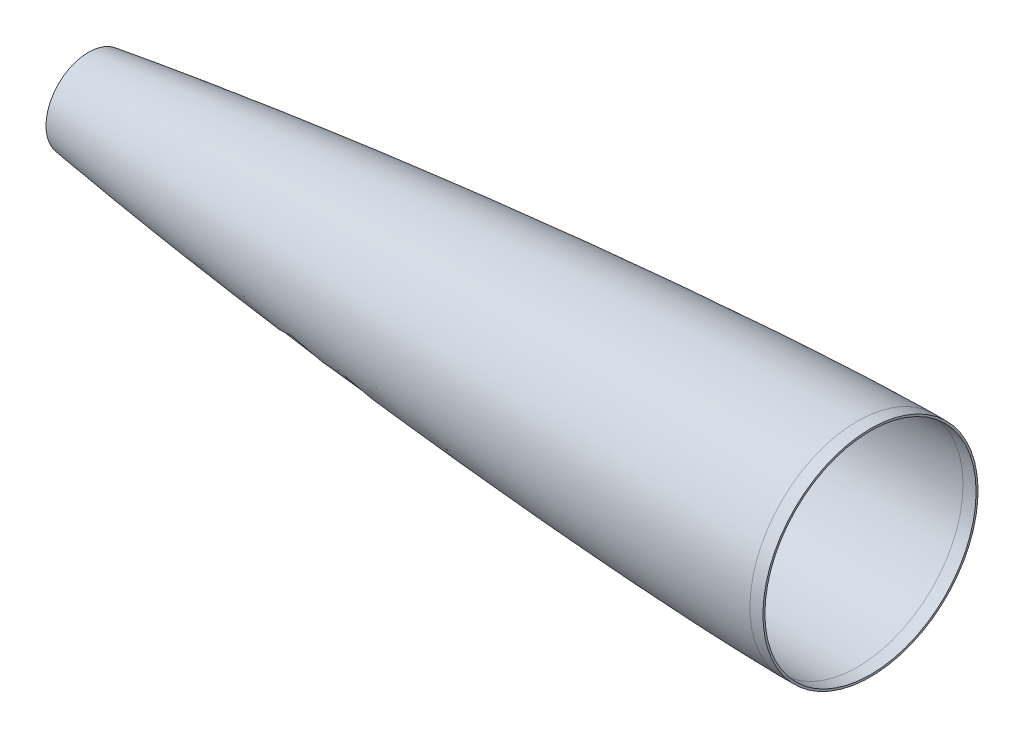
ISO-10303-21;
HEADER;
FILE_DESCRIPTION(('STEP AP214'),'2;1');
FILE_NAME('part.step','',(''),(''),'','','');
FILE_SCHEMA(('AUTOMOTIVE_DESIGN { 1 0 10303 214 1 1 1 1 }'));
ENDSEC;
DATA;
#1=APPLICATION_CONTEXT('core data for automotive mechanical design processes');
#2=APPLICATION_PROTOCOL_DEFINITION('international standard','automotive_design',2000,#1);
#3=PRODUCT_CONTEXT('',#1,'mechanical');
#4=PRODUCT('Part','Part','',(#3));
#5=PRODUCT_RELATED_PRODUCT_CATEGORY('part','',(#4));
#6=PRODUCT_DEFINITION_FORMATION('','',#4);
#7=PRODUCT_DEFINITION_CONTEXT('part definition',#1,'design');
#8=PRODUCT_DEFINITION('design','',#6,#7);
#9=PRODUCT_DEFINITION_SHAPE('','',#8);
#10=(LENGTH_UNIT() NAMED_UNIT(*) SI_UNIT(.MILLI.,.METRE.));
#11=(NAMED_UNIT(*) PLANE_ANGLE_UNIT() SI_UNIT($,.RADIAN.));
#12=(NAMED_UNIT(*) SI_UNIT($,.STERADIAN.) SOLID_ANGLE_UNIT());
#13=UNCERTAINTY_MEASURE_WITH_UNIT(LENGTH_MEASURE(1.E-05),#10,'distance_accuracy_value','');
#14=(GEOMETRIC_REPRESENTATION_CONTEXT(3) GLOBAL_UNCERTAINTY_ASSIGNED_CONTEXT((#13)) GLOBAL_UNIT_ASSIGNED_CONTEXT((#10,
#11,#12)) REPRESENTATION_CONTEXT('',''));
#15=CARTESIAN_POINT('',(0.,0.,0.));
#16=DIRECTION('',(0.,0.,1.));
#17=DIRECTION('',(1.,0.,0.));
#18=AXIS2_PLACEMENT_3D('',#15,#16,#17);
#19=CARTESIAN_POINT('',(0.,0.,0.));
#20=CARTESIAN_POINT('',(0.00246903573026898,0.00769815196811599,0.));
#21=CARTESIAN_POINT('',(0.00852037979638455,0.0225456416973723,0.));
#22=CARTESIAN_POINT('',(0.0254287850938619,0.0499114059335762,0.));
#23=CARTESIAN_POINT('',(0.0656948489665144,0.100096678261966,0.));
#24=CARTESIAN_POINT('',(0.127523873180296,0.16317614387605,0.));
#25=CARTESIAN_POINT('',(0.212062429273832,0.237272492825021,0.));
#26=CARTESIAN_POINT('',(0.332279693831272,0.331578395878514,0.));
#27=CARTESIAN_POINT('',(0.476816380111575,0.434147846193127,0.));
#28=CARTESIAN_POINT('',(0.646496772260084,0.544815951928162,0.));
#29=CARTESIAN_POINT('',(0.841412680935005,0.663024363572451,0.));
#30=CARTESIAN_POINT('',(1.12686422152927,0.826333920179848,0.));
#31=CARTESIAN_POINT('',(1.57274450360088,1.06289215559482,0.));
#32=CARTESIAN_POINT('',(2.33539055045532,1.4322686637271,0.));
#33=CARTESIAN_POINT('',(3.71093173791413,2.02979684979071,0.));
#34=CARTESIAN_POINT('',(6.15457812687039,2.96983830397565,0.));
#35=CARTESIAN_POINT('',(10.6680057521807,4.4902673249165,0.));
#36=CARTESIAN_POINT('',(18.9995170679273,6.91730383821913,0.));
#37=CARTESIAN_POINT('',(33.3857956173297,10.5208699171543,0.));
#38=CARTESIAN_POINT('',(58.21468034422,15.8817272260005,0.));
#39=CARTESIAN_POINT('',(92.5014071109869,22.2363785489674,0.));
#40=CARTESIAN_POINT('',(134.347160824015,29.0668928368045,0.));
#41=CARTESIAN_POINT('',(181.232321927949,35.9138473948452,0.));
#42=CARTESIAN_POINT('',(228.199436648054,42.167572329428,0.));
#43=CARTESIAN_POINT('',(275.229416109303,47.9286839235141,0.));
#44=CARTESIAN_POINT('',(322.309575865078,53.2618983416283,0.));
#45=CARTESIAN_POINT('',(369.432294543761,58.204857708494,0.));
#46=CARTESIAN_POINT('',(416.591925171861,62.781349506755,0.));
#47=CARTESIAN_POINT('',(463.784734461524,67.0021255480557,0.));
#48=CARTESIAN_POINT('',(511.00790004468,70.8684145222591,0.));
#49=CARTESIAN_POINT('',(558.259527801623,74.3703783950666,0.));
#50=CARTESIAN_POINT('',(605.538293136767,77.4858004644496,0.));
#51=CARTESIAN_POINT('',(646.930327878799,79.8372948360595,0.));
#52=CARTESIAN_POINT('',(682.425589554388,81.5391979712966,0.));
#53=CARTESIAN_POINT('',(710.863439025648,82.6553562596267,0.));
#54=CARTESIAN_POINT('',(729.852911101212,83.2590075767634,0.));
#55=CARTESIAN_POINT('',(745.309411706468,83.6327608330306,0.));
#56=CARTESIAN_POINT('',(754.846503833814,83.7859260177921,0.));
#57=CARTESIAN_POINT('',(759.615436090338,83.8348786530274,0.));
#58=CARTESIAN_POINT('',(762.,83.841254665666,0.));
#59=B_SPLINE_CURVE_WITH_KNOTS('',4,(#19,#20,#21,#22,#23,#24,#25,#26,#27,#28,#29,#30,#31,#32,#33,
#34,#35,#36,#37,#38,#39,#40,#41,#42,#43,#44,#45,#46,#47,#48,#49,#50,#51,#52,#53,#54,#55,#56,#57,
#58),.UNSPECIFIED.,.F.,.F.,(5,1,1,1,1,1,1,1,1,1,1,1,1,1,1,1,1,1,1,1,1,1,1,1,1,1,1,1,1,1,1,1,1,1,
1,1,5),(0.,4.17696920660736E-05,8.35393841321473E-05,0.000167078768264295,0.000334157536528589,
0.000501236304792884,0.000668315073057178,0.00096246300283011,0.00125661093260304,
0.0015558461624744,0.00185508139234575,0.00267469423896925,0.00388417928863896,
0.00596702174876591,0.00966166641109553,0.0163036327250282,0.0286756515625839,
0.0511400072011219,0.0868676004745142,0.148543873222001,0.210220157313774,0.271896442541836,
0.333572727029302,0.395249011322683,0.45692529537117,0.518601581123509,0.580277866536271,
0.641954151279229,0.703630435176099,0.765306721163355,0.826983005973056,0.888659290648277,
0.919497433390482,0.950335576132687,0.975167788066344,0.987583894033172,1.),.UNSPECIFIED.);
#60=CARTESIAN_POINT('',(0.,0.,0.));
#61=DIRECTION('',(-1.,0.,0.));
#62=AXIS1_PLACEMENT('',#60,#61);
#63=SURFACE_OF_REVOLUTION('',#59,#62);
#64=CARTESIAN_POINT('',(162.56,0.,0.));
#65=DIRECTION('',(-1.,0.,0.));
#66=DIRECTION('',(0.,-1.,0.));
#67=AXIS2_PLACEMENT_3D('',#64,#65,#66);
#68=CIRCLE('',#67,33.1280498009156);
#69=CARTESIAN_POINT('',(162.56,-33.1280498009156,0.));
#70=VERTEX_POINT('',#69);
#71=EDGE_CURVE('E88',#70,#70,#68,.T.);
#72=ORIENTED_EDGE('',*,*,#71,.F.);
#73=EDGE_LOOP('',(#72));
#74=FACE_BOUND('',#73,.T.);
#75=CARTESIAN_POINT('',(762.,0.,0.));
#76=DIRECTION('',(1.,0.,0.));
#77=DIRECTION('',(0.,1.,0.));
#78=AXIS2_PLACEMENT_3D('',#75,#76,#77);
#79=CIRCLE('',#78,83.841254665666);
#80=CARTESIAN_POINT('',(762.,83.841254665666,0.));
#81=VERTEX_POINT('',#80);
#82=EDGE_CURVE('E46',#81,#81,#79,.T.);
#83=ORIENTED_EDGE('',*,*,#82,.F.);
#84=EDGE_LOOP('',(#83));
#85=FACE_BOUND('',#84,.T.);
#86=ADVANCED_FACE('F34',(#74,#85),#63,.F.);
#87=CARTESIAN_POINT('',(772.16,0.,0.));
#88=DIRECTION('',(1.,0.,0.));
#89=DIRECTION('',(0.,1.,0.));
#90=AXIS2_PLACEMENT_3D('',#87,#88,#89);
#91=PLANE('',#90);
#92=CARTESIAN_POINT('',(772.16,0.,0.));
#93=DIRECTION('',(1.,0.,0.));
#94=DIRECTION('',(0.,1.,0.));
#95=AXIS2_PLACEMENT_3D('',#92,#93,#94);
#96=CIRCLE('',#95,83.841254665666);
#97=CARTESIAN_POINT('',(772.16,83.841254665666,0.));
#98=VERTEX_POINT('',#97);
#99=EDGE_CURVE('E42',#98,#98,#96,.T.);
#100=ORIENTED_EDGE('',*,*,#99,.T.);
#101=EDGE_LOOP('',(#100));
#102=FACE_BOUND('',#101,.T.);
#103=CARTESIAN_POINT('',(772.16,0.,0.));
#104=DIRECTION('',(1.,0.,0.));
#105=DIRECTION('',(0.,1.,0.));
#106=AXIS2_PLACEMENT_3D('',#103,#104,#105);
#107=CIRCLE('',#106,82.3172492013303);
#108=CARTESIAN_POINT('',(772.16,82.3172492013303,0.));
#109=VERTEX_POINT('',#108);
#110=EDGE_CURVE('E92',#109,#109,#107,.T.);
#111=ORIENTED_EDGE('',*,*,#110,.F.);
#112=EDGE_LOOP('',(#111));
#113=FACE_BOUND('',#112,.T.);
#114=ADVANCED_FACE('F68',(#102,#113),#91,.T.);
#115=CARTESIAN_POINT('',(772.16,0.,0.));
#116=DIRECTION('',(-1.,0.,0.));
#117=DIRECTION('',(0.,-1.,0.));
#118=AXIS2_PLACEMENT_3D('',#115,#116,#117);
#119=CYLINDRICAL_SURFACE('',#118,83.841254665666);
#120=ORIENTED_EDGE('',*,*,#99,.F.);
#121=EDGE_LOOP('',(#120));
#122=FACE_BOUND('',#121,.T.);
#123=ORIENTED_EDGE('',*,*,#82,.T.);
#124=EDGE_LOOP('',(#123));
#125=FACE_BOUND('',#124,.T.);
#126=ADVANCED_FACE('F65',(#122,#125),#119,.T.);
#127=CARTESIAN_POINT('',(772.16,0.,0.));
#128=DIRECTION('',(-1.,0.,0.));
#129=DIRECTION('',(0.,-1.,0.));
#130=AXIS2_PLACEMENT_3D('',#127,#128,#129);
#131=CYLINDRICAL_SURFACE('',#130,82.3172492013303);
#132=ORIENTED_EDGE('',*,*,#110,.T.);
#133=EDGE_LOOP('',(#132));
#134=FACE_BOUND('',#133,.T.);
#135=CARTESIAN_POINT('',(762.,0.,0.));
#136=DIRECTION('',(-1.,0.,0.));
#137=DIRECTION('',(0.,-1.,0.));
#138=AXIS2_PLACEMENT_3D('',#135,#136,#137);
#139=CIRCLE('',#138,82.3172492013303);
#140=CARTESIAN_POINT('',(762.,-82.3172492013303,0.));
#141=VERTEX_POINT('',#140);
#142=EDGE_CURVE('E10',#141,#141,#139,.T.);
#143=ORIENTED_EDGE('',*,*,#142,.T.);
#144=EDGE_LOOP('',(#143));
#145=FACE_BOUND('',#144,.T.);
#146=ADVANCED_FACE('F63',(#134,#145),#131,.F.);
#147=CARTESIAN_POINT('',(1.22624736371108,-0.904927291549788,0.));
#148=CARTESIAN_POINT('',(1.29238757369697,-0.854575698996548,0.));
#149=CARTESIAN_POINT('',(1.41798473136319,-0.76973960232933,0.));
#150=CARTESIAN_POINT('',(1.77925671910617,-0.551351422615195,0.));
#151=CARTESIAN_POINT('',(2.27055264808828,-0.29241478934892,0.));
#152=CARTESIAN_POINT('',(2.90286536887014,0.00966719713114392,0.));
#153=CARTESIAN_POINT('',(3.77218967131843,0.394557939336411,0.));
#154=CARTESIAN_POINT('',(4.89259346776725,0.849688542058025,0.));
#155=CARTESIAN_POINT('',(6.7215505198936,1.53547194025491,0.));
#156=CARTESIAN_POINT('',(9.05126874077709,2.33309025082967,0.));
#157=CARTESIAN_POINT('',(12.8260187082185,3.52277641383664,0.));
#158=CARTESIAN_POINT('',(17.5992780576472,4.89095774854577,0.));
#159=CARTESIAN_POINT('',(23.3735636614286,6.41324787433753,0.));
#160=CARTESIAN_POINT('',(29.1765161414983,7.84613638224722,0.));
#161=CARTESIAN_POINT('',(36.9430029300737,9.66397178352974,0.));
#162=CARTESIAN_POINT('',(46.6890629361599,11.7983464859274,0.));
#163=CARTESIAN_POINT('',(58.4248745023393,14.1977381724473,0.));
#164=CARTESIAN_POINT('',(70.1889222389616,16.4735911940224,0.));
#165=CARTESIAN_POINT('',(81.9746024506248,18.6463018003076,0.));
#166=CARTESIAN_POINT('',(97.7126462104753,21.4264771404721,0.));
#167=CARTESIAN_POINT('',(117.42065459818,24.7165071469243,0.));
#168=CARTESIAN_POINT('',(141.110859364378,28.4298260355867,0.));
#169=CARTESIAN_POINT('',(164.833348494528,31.9463538370005,0.));
#170=CARTESIAN_POINT('',(188.581698126068,35.2939982209626,0.));
#171=CARTESIAN_POINT('',(212.35162110364,38.4926827109333,0.));
#172=CARTESIAN_POINT('',(244.069560818398,42.5777413527682,0.));
#173=CARTESIAN_POINT('',(283.757517922422,47.3754160882014,0.));
#174=CARTESIAN_POINT('',(331.434490554099,52.701690304347,0.));
#175=CARTESIAN_POINT('',(379.154862580651,57.6328997588356,0.));
#176=CARTESIAN_POINT('',(426.912731663558,62.1912653354065,0.));
#177=CARTESIAN_POINT('',(490.634576057845,67.782687663526,0.));
#178=CARTESIAN_POINT('',(554.417145385623,72.6492934498924,0.));
#179=CARTESIAN_POINT('',(618.25236477605,76.7094241773297,0.));
#180=CARTESIAN_POINT('',(658.170250279788,78.8666567220527,0.));
#181=CARTESIAN_POINT('',(690.11567158674,80.3158640595351,0.));
#182=CARTESIAN_POINT('',(714.080440132601,81.2402294094363,0.));
#183=CARTESIAN_POINT('',(734.052133379079,81.8501506540675,0.));
#184=CARTESIAN_POINT('',(750.033965619028,82.1910347969252,0.));
#185=CARTESIAN_POINT('',(758.012770929254,82.3065878876131,0.));
#186=CARTESIAN_POINT('',(762.004074962506,82.3172601136151,0.));
#187=B_SPLINE_CURVE_WITH_KNOTS('',3,(#147,#148,#149,#150,#151,#152,#153,#154,#155,#156,#157,
#158,#159,#160,#161,#162,#163,#164,#165,#166,#167,#168,#169,#170,#171,#172,#173,#174,#175,#176,
#177,#178,#179,#180,#181,#182,#183,#184,#185,#186),.UNSPECIFIED.,.F.,.F.,(4,1,1,1,1,1,1,1,1,1,1,
1,1,1,1,1,1,1,1,1,1,1,1,1,1,1,1,1,1,1,1,1,1,1,1,1,1,4),(0.000567495302183308,
0.00105549945486779,0.00154350360755227,0.00251951191292123,0.00349552021829019,
0.00447152852365915,0.00642354513439708,0.008375561745135,0.0122795949666108,0.0161836281880867,
0.0239916946310384,0.0317997610739901,0.0396078275169418,0.0474158939598935,0.0630320268457969,
0.0786481597317003,0.0942642926176036,0.109880425503507,0.12549655838941,0.156728824161217,
0.187961089933024,0.219193355704831,0.250425621476637,0.281657887248444,0.312890153020251,
0.375354684563865,0.437819216107478,0.500283747651092,0.562748279194705,0.625212810738319,
0.750141873825546,0.812606405369159,0.875070936912773,0.90630320268458,0.937535468456386,
0.968767734228193,0.984383867114097,1.),.UNSPECIFIED.);
#188=CARTESIAN_POINT('',(0.,0.,0.));
#189=DIRECTION('',(-1.,0.,0.));
#190=AXIS1_PLACEMENT('',#188,#189);
#191=SURFACE_OF_REVOLUTION('',#187,#190);
#192=CARTESIAN_POINT('',(162.56,0.,0.));
#193=DIRECTION('',(-1.,0.,0.));
#194=DIRECTION('',(0.,-1.,0.));
#195=AXIS2_PLACEMENT_3D('',#192,#193,#194);
#196=CIRCLE('',#195,31.5880633811906);
#197=CARTESIAN_POINT('',(162.56,-31.5880633811906,0.));
#198=VERTEX_POINT('',#197);
#199=EDGE_CURVE('E38',#198,#198,#196,.T.);
#200=ORIENTED_EDGE('',*,*,#199,.T.);
#201=EDGE_LOOP('',(#200));
#202=FACE_BOUND('',#201,.T.);
#203=ORIENTED_EDGE('',*,*,#142,.F.);
#204=EDGE_LOOP('',(#203));
#205=FACE_BOUND('',#204,.T.);
#206=ADVANCED_FACE('F59',(#202,#205),#191,.T.);
#207=CARTESIAN_POINT('',(162.56,0.,0.));
#208=DIRECTION('',(1.,0.,0.));
#209=DIRECTION('',(0.,1.,0.));
#210=AXIS2_PLACEMENT_3D('',#207,#208,#209);
#211=PLANE('',#210);
#212=ORIENTED_EDGE('',*,*,#71,.T.);
#213=EDGE_LOOP('',(#212));
#214=FACE_BOUND('',#213,.T.);
#215=ORIENTED_EDGE('',*,*,#199,.F.);
#216=EDGE_LOOP('',(#215));
#217=FACE_BOUND('',#216,.T.);
#218=ADVANCED_FACE('F62',(#214,#217),#211,.F.);
#219=CLOSED_SHELL('',(#86,#114,#126,#146,#206,#218));
#220=MANIFOLD_SOLID_BREP('B2',#219);
#221=ADVANCED_BREP_SHAPE_REPRESENTATION('',(#18,#220),#14);
#222=SHAPE_DEFINITION_REPRESENTATION(#9,#221);
ENDSEC;
END-ISO-10303-21;
